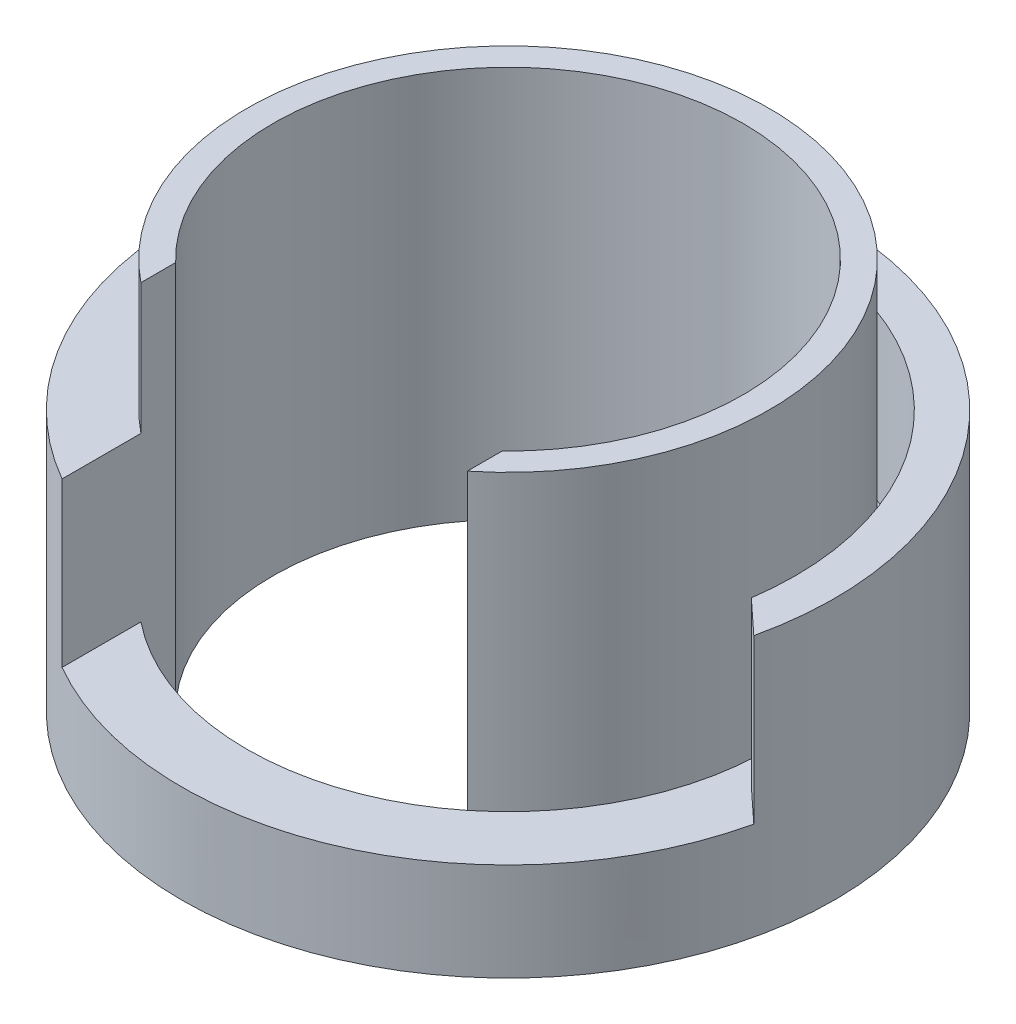
ISO-10303-21;
HEADER;
FILE_DESCRIPTION(('STEP AP214'),'2;1');
FILE_NAME('part.step','',(''),(''),'','','');
FILE_SCHEMA(('AUTOMOTIVE_DESIGN { 1 0 10303 214 1 1 1 1 }'));
ENDSEC;
DATA;
#1=APPLICATION_CONTEXT('core data for automotive mechanical design processes');
#2=APPLICATION_PROTOCOL_DEFINITION('international standard','automotive_design',2000,#1);
#3=PRODUCT_CONTEXT('',#1,'mechanical');
#4=PRODUCT('Part','Part','',(#3));
#5=PRODUCT_RELATED_PRODUCT_CATEGORY('part','',(#4));
#6=PRODUCT_DEFINITION_FORMATION('','',#4);
#7=PRODUCT_DEFINITION_CONTEXT('part definition',#1,'design');
#8=PRODUCT_DEFINITION('design','',#6,#7);
#9=PRODUCT_DEFINITION_SHAPE('','',#8);
#10=(LENGTH_UNIT() NAMED_UNIT(*) SI_UNIT(.MILLI.,.METRE.));
#11=(NAMED_UNIT(*) PLANE_ANGLE_UNIT() SI_UNIT($,.RADIAN.));
#12=(NAMED_UNIT(*) SI_UNIT($,.STERADIAN.) SOLID_ANGLE_UNIT());
#13=UNCERTAINTY_MEASURE_WITH_UNIT(LENGTH_MEASURE(1.E-05),#10,'distance_accuracy_value','');
#14=(GEOMETRIC_REPRESENTATION_CONTEXT(3) GLOBAL_UNCERTAINTY_ASSIGNED_CONTEXT((#13)) GLOBAL_UNIT_ASSIGNED_CONTEXT((#10,
#11,#12)) REPRESENTATION_CONTEXT('',''));
#15=CARTESIAN_POINT('',(0.,0.,0.));
#16=DIRECTION('',(0.,0.,1.));
#17=DIRECTION('',(1.,0.,0.));
#18=AXIS2_PLACEMENT_3D('',#15,#16,#17);
#19=CARTESIAN_POINT('',(0.,20.,0.));
#20=DIRECTION('',(0.,-1.,0.));
#21=DIRECTION('',(0.,0.,-1.));
#22=AXIS2_PLACEMENT_3D('',#19,#20,#21);
#23=CYLINDRICAL_SURFACE('',#22,20.);
#24=DIRECTION('',(0.,1.,0.));
#25=VECTOR('',#24,1.);
#26=CARTESIAN_POINT('',(-12.5,-53.5560435416942,15.612494995996));
#27=LINE('',#26,#25);
#28=CARTESIAN_POINT('',(-12.5,0.,15.612494995996));
#29=VERTEX_POINT('',#28);
#30=CARTESIAN_POINT('',(-12.5,7.5,15.612494995996));
#31=VERTEX_POINT('',#30);
#32=EDGE_CURVE('E56',#29,#31,#27,.T.);
#33=ORIENTED_EDGE('',*,*,#32,.T.);
#34=CARTESIAN_POINT('',(0.,7.5,0.));
#35=DIRECTION('',(0.,-1.,0.));
#36=DIRECTION('',(0.,0.,1.));
#37=AXIS2_PLACEMENT_3D('',#34,#35,#36);
#38=CIRCLE('',#37,20.);
#39=CARTESIAN_POINT('',(12.5,7.5,15.612494995996));
#40=VERTEX_POINT('',#39);
#41=EDGE_CURVE('E138',#40,#31,#38,.T.);
#42=ORIENTED_EDGE('',*,*,#41,.F.);
#43=DIRECTION('',(0.,1.,0.));
#44=VECTOR('',#43,1.);
#45=CARTESIAN_POINT('',(12.5,-53.5560435416942,15.612494995996));
#46=LINE('',#45,#44);
#47=CARTESIAN_POINT('',(12.5,0.,15.612494995996));
#48=VERTEX_POINT('',#47);
#49=EDGE_CURVE('E180',#48,#40,#46,.T.);
#50=ORIENTED_EDGE('',*,*,#49,.F.);
#51=CARTESIAN_POINT('',(0.,0.,0.));
#52=DIRECTION('',(0.,1.,0.));
#53=DIRECTION('',(0.,0.,1.));
#54=AXIS2_PLACEMENT_3D('',#51,#52,#53);
#55=CIRCLE('',#54,20.);
#56=EDGE_CURVE('E192',#29,#48,#55,.T.);
#57=ORIENTED_EDGE('',*,*,#56,.F.);
#58=EDGE_LOOP('',(#33,#42,#50,#57));
#59=FACE_BOUND('',#58,.T.);
#60=ADVANCED_FACE('F35',(#59),#23,.F.);
#61=CARTESIAN_POINT('',(0.,20.,0.));
#62=DIRECTION('',(0.,1.,0.));
#63=DIRECTION('',(0.,0.,1.));
#64=AXIS2_PLACEMENT_3D('',#61,#62,#63);
#65=PLANE('',#64);
#66=DIRECTION('',(0.12392464077455,0.,-0.99229163223767));
#67=VECTOR('',#66,1.);
#68=CARTESIAN_POINT('',(3.09811601936377,20.,-24.8072908059417));
#69=LINE('',#68,#67);
#70=CARTESIAN_POINT('',(2.72634209704013,20.,-21.8304159092287));
#71=VERTEX_POINT('',#70);
#72=CARTESIAN_POINT('',(3.09811601936377,20.,-24.8072908059417));
#73=VERTEX_POINT('',#72);
#74=EDGE_CURVE('E149',#71,#73,#69,.T.);
#75=ORIENTED_EDGE('',*,*,#74,.F.);
#76=CARTESIAN_POINT('',(0.,20.,0.));
#77=DIRECTION('',(0.,1.,0.));
#78=DIRECTION('',(0.,0.,1.));
#79=AXIS2_PLACEMENT_3D('',#76,#77,#78);
#80=CIRCLE('',#79,22.);
#81=CARTESIAN_POINT('',(21.7739745366638,20.,3.14547816344585));
#82=VERTEX_POINT('',#81);
#83=EDGE_CURVE('E363',#82,#71,#80,.T.);
#84=ORIENTED_EDGE('',*,*,#83,.F.);
#85=DIRECTION('',(-0.733212111192935,0.,-0.68));
#86=VECTOR('',#85,1.);
#87=CARTESIAN_POINT('',(21.7739745366638,20.,3.14547816344585));
#88=LINE('',#87,#86);
#89=CARTESIAN_POINT('',(24.3745078663875,20.,5.55728047442378));
#90=VERTEX_POINT('',#89);
#91=EDGE_CURVE('E370',#90,#82,#88,.T.);
#92=ORIENTED_EDGE('',*,*,#91,.F.);
#93=CARTESIAN_POINT('',(0.,20.,0.));
#94=DIRECTION('',(0.,1.,0.));
#95=DIRECTION('',(0.,0.,1.));
#96=AXIS2_PLACEMENT_3D('',#93,#94,#95);
#97=CIRCLE('',#96,25.);
#98=EDGE_CURVE('E11',#90,#73,#97,.T.);
#99=ORIENTED_EDGE('',*,*,#98,.T.);
#100=EDGE_LOOP('',(#75,#84,#92,#99));
#101=FACE_BOUND('',#100,.T.);
#102=ADVANCED_FACE('F215',(#101),#65,.T.);
#103=CARTESIAN_POINT('',(0.,20.,0.));
#104=DIRECTION('',(0.,-1.,0.));
#105=DIRECTION('',(0.,0.,-1.));
#106=AXIS2_PLACEMENT_3D('',#103,#104,#105);
#107=CYLINDRICAL_SURFACE('',#106,25.);
#108=CARTESIAN_POINT('',(0.,7.5,0.));
#109=DIRECTION('',(0.,1.,0.));
#110=DIRECTION('',(0.,0.,1.));
#111=AXIS2_PLACEMENT_3D('',#108,#109,#110);
#112=CIRCLE('',#111,25.);
#113=CARTESIAN_POINT('',(3.09811601936377,7.5,-24.8072908059417));
#114=VERTEX_POINT('',#113);
#115=CARTESIAN_POINT('',(-18.3303027798234,7.5,-17.));
#116=VERTEX_POINT('',#115);
#117=EDGE_CURVE('E139',#114,#116,#112,.T.);
#118=ORIENTED_EDGE('',*,*,#117,.F.);
#119=DIRECTION('',(0.,1.,0.));
#120=VECTOR('',#119,1.);
#121=CARTESIAN_POINT('',(3.09811601936377,7.5,-24.8072908059417));
#122=LINE('',#121,#120);
#123=EDGE_CURVE('E167',#114,#73,#122,.T.);
#124=ORIENTED_EDGE('',*,*,#123,.T.);
#125=ORIENTED_EDGE('',*,*,#98,.F.);
#126=DIRECTION('',(0.,1.,0.));
#127=VECTOR('',#126,1.);
#128=CARTESIAN_POINT('',(24.3745078663875,7.5,5.55728047442378));
#129=LINE('',#128,#127);
#130=CARTESIAN_POINT('',(24.3745078663875,7.5,5.55728047442378));
#131=VERTEX_POINT('',#130);
#132=EDGE_CURVE('E381',#131,#90,#129,.T.);
#133=ORIENTED_EDGE('',*,*,#132,.F.);
#134=CARTESIAN_POINT('',(0.,7.5,0.));
#135=DIRECTION('',(0.,1.,0.));
#136=DIRECTION('',(0.,0.,1.));
#137=AXIS2_PLACEMENT_3D('',#134,#135,#136);
#138=CIRCLE('',#137,25.);
#139=CARTESIAN_POINT('',(-12.5,7.5,21.650635094611));
#140=VERTEX_POINT('',#139);
#141=EDGE_CURVE('E384',#140,#131,#138,.T.);
#142=ORIENTED_EDGE('',*,*,#141,.F.);
#143=DIRECTION('',(0.,1.,0.));
#144=VECTOR('',#143,1.);
#145=CARTESIAN_POINT('',(-12.5,7.5,21.650635094611));
#146=LINE('',#145,#144);
#147=CARTESIAN_POINT('',(-12.5,20.,21.650635094611));
#148=VERTEX_POINT('',#147);
#149=EDGE_CURVE('E157',#140,#148,#146,.T.);
#150=ORIENTED_EDGE('',*,*,#149,.T.);
#151=CARTESIAN_POINT('',(-18.3303027798234,20.,-17.));
#152=VERTEX_POINT('',#151);
#153=EDGE_CURVE('E43',#152,#148,#97,.T.);
#154=ORIENTED_EDGE('',*,*,#153,.F.);
#155=DIRECTION('',(0.,1.,0.));
#156=VECTOR('',#155,1.);
#157=CARTESIAN_POINT('',(-18.3303027798234,7.5,-17.));
#158=LINE('',#157,#156);
#159=EDGE_CURVE('E132',#116,#152,#158,.T.);
#160=ORIENTED_EDGE('',*,*,#159,.F.);
#161=EDGE_LOOP('',(#118,#124,#125,#133,#142,#150,#154,#160));
#162=FACE_BOUND('',#161,.T.);
#163=CARTESIAN_POINT('',(0.,0.,0.));
#164=DIRECTION('',(0.,1.,0.));
#165=DIRECTION('',(0.,0.,1.));
#166=AXIS2_PLACEMENT_3D('',#163,#164,#165);
#167=CIRCLE('',#166,25.);
#168=CARTESIAN_POINT('',(0.,0.,25.));
#169=VERTEX_POINT('',#168);
#170=EDGE_CURVE('E38',#169,#169,#167,.T.);
#171=ORIENTED_EDGE('',*,*,#170,.T.);
#172=EDGE_LOOP('',(#171));
#173=FACE_BOUND('',#172,.T.);
#174=ADVANCED_FACE('F152',(#162,#173),#107,.T.);
#175=DIRECTION('',(0.,0.,1.));
#176=VECTOR('',#175,1.);
#177=CARTESIAN_POINT('',(-12.5,20.,21.650635094611));
#178=LINE('',#177,#176);
#179=CARTESIAN_POINT('',(-12.5,20.,15.612494995996));
#180=VERTEX_POINT('',#179);
#181=EDGE_CURVE('E371',#180,#148,#178,.T.);
#182=ORIENTED_EDGE('',*,*,#181,.F.);
#183=CARTESIAN_POINT('',(0.,20.,0.));
#184=DIRECTION('',(0.,1.,0.));
#185=DIRECTION('',(0.,0.,1.));
#186=AXIS2_PLACEMENT_3D('',#183,#184,#185);
#187=CIRCLE('',#186,20.);
#188=CARTESIAN_POINT('',(-14.6642422238587,20.,-13.6));
#189=VERTEX_POINT('',#188);
#190=EDGE_CURVE('E193',#189,#180,#187,.T.);
#191=ORIENTED_EDGE('',*,*,#190,.F.);
#192=DIRECTION('',(0.733212111192935,0.,0.68));
#193=VECTOR('',#192,1.);
#194=CARTESIAN_POINT('',(-18.3303027798234,20.,-17.));
#195=LINE('',#194,#193);
#196=EDGE_CURVE('E374',#152,#189,#195,.T.);
#197=ORIENTED_EDGE('',*,*,#196,.F.);
#198=ORIENTED_EDGE('',*,*,#153,.T.);
#199=EDGE_LOOP('',(#182,#191,#197,#198));
#200=FACE_BOUND('',#199,.T.);
#201=ADVANCED_FACE('F204',(#200),#65,.T.);
#202=CARTESIAN_POINT('',(0.,0.,0.));
#203=DIRECTION('',(0.,1.,0.));
#204=DIRECTION('',(0.,0.,1.));
#205=AXIS2_PLACEMENT_3D('',#202,#203,#204);
#206=PLANE('',#205);
#207=ORIENTED_EDGE('',*,*,#56,.T.);
#208=DIRECTION('',(0.,0.,-1.));
#209=VECTOR('',#208,1.);
#210=CARTESIAN_POINT('',(12.5,0.,15.612494995996));
#211=LINE('',#210,#209);
#212=CARTESIAN_POINT('',(12.5,0.,12.9518338469886));
#213=VERTEX_POINT('',#212);
#214=EDGE_CURVE('E179',#48,#213,#211,.T.);
#215=ORIENTED_EDGE('',*,*,#214,.T.);
#216=CARTESIAN_POINT('',(0.,0.,0.));
#217=DIRECTION('',(0.,1.,0.));
#218=DIRECTION('',(0.,0.,1.));
#219=AXIS2_PLACEMENT_3D('',#216,#217,#218);
#220=CIRCLE('',#219,18.);
#221=CARTESIAN_POINT('',(-12.5,0.,12.9518338469886));
#222=VERTEX_POINT('',#221);
#223=EDGE_CURVE('E177',#213,#222,#220,.T.);
#224=ORIENTED_EDGE('',*,*,#223,.T.);
#225=DIRECTION('',(0.,0.,1.));
#226=VECTOR('',#225,1.);
#227=CARTESIAN_POINT('',(-12.5,0.,15.612494995996));
#228=LINE('',#227,#226);
#229=EDGE_CURVE('E182',#222,#29,#228,.T.);
#230=ORIENTED_EDGE('',*,*,#229,.T.);
#231=EDGE_LOOP('',(#207,#215,#224,#230));
#232=FACE_BOUND('',#231,.T.);
#233=ORIENTED_EDGE('',*,*,#170,.F.);
#234=EDGE_LOOP('',(#233));
#235=FACE_BOUND('',#234,.T.);
#236=ADVANCED_FACE('F201',(#232,#235),#206,.F.);
#237=CARTESIAN_POINT('',(0.,-53.5560435416942,0.));
#238=DIRECTION('',(0.,1.,0.));
#239=DIRECTION('',(0.,0.,1.));
#240=AXIS2_PLACEMENT_3D('',#237,#238,#239);
#241=CYLINDRICAL_SURFACE('',#240,20.);
#242=CARTESIAN_POINT('',(12.5,30.,15.612494995996));
#243=VERTEX_POINT('',#242);
#244=EDGE_CURVE('E185',#40,#243,#46,.T.);
#245=ORIENTED_EDGE('',*,*,#244,.F.);
#246=CARTESIAN_POINT('',(-14.6642422238587,7.5,-13.6));
#247=VERTEX_POINT('',#246);
#248=EDGE_CURVE('E393',#247,#40,#38,.T.);
#249=ORIENTED_EDGE('',*,*,#248,.F.);
#250=DIRECTION('',(0.,1.,0.));
#251=VECTOR('',#250,1.);
#252=CARTESIAN_POINT('',(-14.6642422238587,7.5,-13.6));
#253=LINE('',#252,#251);
#254=EDGE_CURVE('E134',#247,#189,#253,.T.);
#255=ORIENTED_EDGE('',*,*,#254,.T.);
#256=ORIENTED_EDGE('',*,*,#190,.T.);
#257=CARTESIAN_POINT('',(-12.5,30.,15.612494995996));
#258=VERTEX_POINT('',#257);
#259=EDGE_CURVE('E176',#180,#258,#27,.T.);
#260=ORIENTED_EDGE('',*,*,#259,.T.);
#261=CARTESIAN_POINT('',(0.,30.,0.));
#262=DIRECTION('',(0.,1.,0.));
#263=DIRECTION('',(0.,0.,1.));
#264=AXIS2_PLACEMENT_3D('',#261,#262,#263);
#265=CIRCLE('',#264,20.);
#266=EDGE_CURVE('E163',#243,#258,#265,.T.);
#267=ORIENTED_EDGE('',*,*,#266,.F.);
#268=EDGE_LOOP('',(#245,#249,#255,#256,#260,#267));
#269=FACE_BOUND('',#268,.T.);
#270=ADVANCED_FACE('F203',(#269),#241,.T.);
#271=CARTESIAN_POINT('',(12.5,-53.5560435416942,15.612494995996));
#272=DIRECTION('',(-1.,0.,0.));
#273=DIRECTION('',(0.,0.,1.));
#274=AXIS2_PLACEMENT_3D('',#271,#272,#273);
#275=PLANE('',#274);
#276=ORIENTED_EDGE('',*,*,#214,.F.);
#277=ORIENTED_EDGE('',*,*,#49,.T.);
#278=ORIENTED_EDGE('',*,*,#244,.T.);
#279=DIRECTION('',(0.,0.,1.));
#280=VECTOR('',#279,1.);
#281=CARTESIAN_POINT('',(12.5,30.,15.612494995996));
#282=LINE('',#281,#280);
#283=CARTESIAN_POINT('',(12.5,30.,12.9518338469886));
#284=VERTEX_POINT('',#283);
#285=EDGE_CURVE('E173',#284,#243,#282,.T.);
#286=ORIENTED_EDGE('',*,*,#285,.F.);
#287=DIRECTION('',(0.,1.,0.));
#288=VECTOR('',#287,1.);
#289=CARTESIAN_POINT('',(12.5,-53.5560435416942,12.9518338469886));
#290=LINE('',#289,#288);
#291=EDGE_CURVE('E186',#213,#284,#290,.T.);
#292=ORIENTED_EDGE('',*,*,#291,.F.);
#293=EDGE_LOOP('',(#276,#277,#278,#286,#292));
#294=FACE_BOUND('',#293,.T.);
#295=ADVANCED_FACE('F210',(#294),#275,.T.);
#296=CARTESIAN_POINT('',(0.,-53.5560435416942,0.));
#297=DIRECTION('',(0.,1.,0.));
#298=DIRECTION('',(0.,0.,1.));
#299=AXIS2_PLACEMENT_3D('',#296,#297,#298);
#300=CYLINDRICAL_SURFACE('',#299,18.);
#301=ORIENTED_EDGE('',*,*,#223,.F.);
#302=ORIENTED_EDGE('',*,*,#291,.T.);
#303=CARTESIAN_POINT('',(0.,30.,0.));
#304=DIRECTION('',(0.,-1.,0.));
#305=DIRECTION('',(0.,0.,1.));
#306=AXIS2_PLACEMENT_3D('',#303,#304,#305);
#307=CIRCLE('',#306,18.);
#308=CARTESIAN_POINT('',(-12.5,30.,12.9518338469886));
#309=VERTEX_POINT('',#308);
#310=EDGE_CURVE('E170',#309,#284,#307,.T.);
#311=ORIENTED_EDGE('',*,*,#310,.F.);
#312=DIRECTION('',(0.,1.,0.));
#313=VECTOR('',#312,1.);
#314=CARTESIAN_POINT('',(-12.5,-53.5560435416942,12.9518338469886));
#315=LINE('',#314,#313);
#316=EDGE_CURVE('E188',#222,#309,#315,.T.);
#317=ORIENTED_EDGE('',*,*,#316,.F.);
#318=EDGE_LOOP('',(#301,#302,#311,#317));
#319=FACE_BOUND('',#318,.T.);
#320=ADVANCED_FACE('F230',(#319),#300,.F.);
#321=CARTESIAN_POINT('',(-12.5,-53.5560435416942,15.612494995996));
#322=DIRECTION('',(1.,0.,0.));
#323=DIRECTION('',(0.,0.,-1.));
#324=AXIS2_PLACEMENT_3D('',#321,#322,#323);
#325=PLANE('',#324);
#326=ORIENTED_EDGE('',*,*,#229,.F.);
#327=ORIENTED_EDGE('',*,*,#316,.T.);
#328=DIRECTION('',(0.,0.,-1.));
#329=VECTOR('',#328,1.);
#330=CARTESIAN_POINT('',(-12.5,30.,15.612494995996));
#331=LINE('',#330,#329);
#332=EDGE_CURVE('E166',#258,#309,#331,.T.);
#333=ORIENTED_EDGE('',*,*,#332,.F.);
#334=ORIENTED_EDGE('',*,*,#259,.F.);
#335=ORIENTED_EDGE('',*,*,#181,.T.);
#336=ORIENTED_EDGE('',*,*,#149,.F.);
#337=DIRECTION('',(0.,0.,1.));
#338=VECTOR('',#337,1.);
#339=CARTESIAN_POINT('',(-12.5,7.5,21.650635094611));
#340=LINE('',#339,#338);
#341=EDGE_CURVE('E51',#31,#140,#340,.T.);
#342=ORIENTED_EDGE('',*,*,#341,.F.);
#343=ORIENTED_EDGE('',*,*,#32,.F.);
#344=EDGE_LOOP('',(#326,#327,#333,#334,#335,#336,#342,#343));
#345=FACE_BOUND('',#344,.T.);
#346=ADVANCED_FACE('F233',(#345),#325,.T.);
#347=CARTESIAN_POINT('',(0.,30.,0.));
#348=DIRECTION('',(0.,1.,0.));
#349=DIRECTION('',(0.,0.,1.));
#350=AXIS2_PLACEMENT_3D('',#347,#348,#349);
#351=PLANE('',#350);
#352=ORIENTED_EDGE('',*,*,#266,.T.);
#353=ORIENTED_EDGE('',*,*,#332,.T.);
#354=ORIENTED_EDGE('',*,*,#310,.T.);
#355=ORIENTED_EDGE('',*,*,#285,.T.);
#356=EDGE_LOOP('',(#352,#353,#354,#355));
#357=FACE_BOUND('',#356,.T.);
#358=ADVANCED_FACE('F235',(#357),#351,.T.);
#359=CARTESIAN_POINT('',(3.09811601936377,7.5,-24.8072908059417));
#360=DIRECTION('',(0.99229163223767,0.,0.12392464077455));
#361=DIRECTION('',(0.12392464077455,0.,-0.99229163223767));
#362=AXIS2_PLACEMENT_3D('',#359,#360,#361);
#363=PLANE('',#362);
#364=ORIENTED_EDGE('',*,*,#74,.T.);
#365=ORIENTED_EDGE('',*,*,#123,.F.);
#366=DIRECTION('',(0.12392464077455,0.,-0.99229163223767));
#367=VECTOR('',#366,1.);
#368=CARTESIAN_POINT('',(3.09811601936377,7.5,-24.8072908059417));
#369=LINE('',#368,#367);
#370=CARTESIAN_POINT('',(2.72634209704013,7.5,-21.8304159092287));
#371=VERTEX_POINT('',#370);
#372=EDGE_CURVE('E146',#371,#114,#369,.T.);
#373=ORIENTED_EDGE('',*,*,#372,.F.);
#374=DIRECTION('',(0.,1.,0.));
#375=VECTOR('',#374,1.);
#376=CARTESIAN_POINT('',(2.72634209704013,7.5,-21.8304159092287));
#377=LINE('',#376,#375);
#378=EDGE_CURVE('E360',#371,#71,#377,.T.);
#379=ORIENTED_EDGE('',*,*,#378,.T.);
#380=EDGE_LOOP('',(#364,#365,#373,#379));
#381=FACE_BOUND('',#380,.T.);
#382=ADVANCED_FACE('F241',(#381),#363,.F.);
#383=CARTESIAN_POINT('',(0.,7.5,0.));
#384=DIRECTION('',(0.,1.,0.));
#385=DIRECTION('',(0.,0.,1.));
#386=AXIS2_PLACEMENT_3D('',#383,#384,#385);
#387=CYLINDRICAL_SURFACE('',#386,22.);
#388=ORIENTED_EDGE('',*,*,#83,.T.);
#389=ORIENTED_EDGE('',*,*,#378,.F.);
#390=CARTESIAN_POINT('',(0.,7.5,0.));
#391=DIRECTION('',(0.,1.,0.));
#392=DIRECTION('',(0.,0.,1.));
#393=AXIS2_PLACEMENT_3D('',#390,#391,#392);
#394=CIRCLE('',#393,22.);
#395=CARTESIAN_POINT('',(21.7739745366638,7.5,3.14547816344585));
#396=VERTEX_POINT('',#395);
#397=EDGE_CURVE('E159',#396,#371,#394,.T.);
#398=ORIENTED_EDGE('',*,*,#397,.F.);
#399=DIRECTION('',(0.,1.,0.));
#400=VECTOR('',#399,1.);
#401=CARTESIAN_POINT('',(21.7739745366638,7.5,3.14547816344585));
#402=LINE('',#401,#400);
#403=EDGE_CURVE('E379',#396,#82,#402,.T.);
#404=ORIENTED_EDGE('',*,*,#403,.T.);
#405=EDGE_LOOP('',(#388,#389,#398,#404));
#406=FACE_BOUND('',#405,.T.);
#407=ADVANCED_FACE('F253',(#406),#387,.F.);
#408=CARTESIAN_POINT('',(21.7739745366638,7.5,3.14547816344585));
#409=DIRECTION('',(0.68,0.,-0.733212111192935));
#410=DIRECTION('',(-0.733212111192935,0.,-0.68));
#411=AXIS2_PLACEMENT_3D('',#408,#409,#410);
#412=PLANE('',#411);
#413=ORIENTED_EDGE('',*,*,#91,.T.);
#414=ORIENTED_EDGE('',*,*,#403,.F.);
#415=DIRECTION('',(-0.733212111192935,0.,-0.68));
#416=VECTOR('',#415,1.);
#417=CARTESIAN_POINT('',(21.7739745366638,7.5,3.14547816344585));
#418=LINE('',#417,#416);
#419=EDGE_CURVE('E388',#131,#396,#418,.T.);
#420=ORIENTED_EDGE('',*,*,#419,.F.);
#421=ORIENTED_EDGE('',*,*,#132,.T.);
#422=EDGE_LOOP('',(#413,#414,#420,#421));
#423=FACE_BOUND('',#422,.T.);
#424=ADVANCED_FACE('F250',(#423),#412,.F.);
#425=CARTESIAN_POINT('',(-18.3303027798234,7.5,-17.));
#426=DIRECTION('',(-0.68,0.,0.733212111192935));
#427=DIRECTION('',(0.733212111192935,0.,0.68));
#428=AXIS2_PLACEMENT_3D('',#425,#426,#427);
#429=PLANE('',#428);
#430=ORIENTED_EDGE('',*,*,#196,.T.);
#431=ORIENTED_EDGE('',*,*,#254,.F.);
#432=DIRECTION('',(0.733212111192935,0.,0.68));
#433=VECTOR('',#432,1.);
#434=CARTESIAN_POINT('',(-18.3303027798234,7.5,-17.));
#435=LINE('',#434,#433);
#436=EDGE_CURVE('E127',#116,#247,#435,.T.);
#437=ORIENTED_EDGE('',*,*,#436,.F.);
#438=ORIENTED_EDGE('',*,*,#159,.T.);
#439=EDGE_LOOP('',(#430,#431,#437,#438));
#440=FACE_BOUND('',#439,.T.);
#441=ADVANCED_FACE('F130',(#440),#429,.F.);
#442=CARTESIAN_POINT('',(0.,7.5,0.));
#443=DIRECTION('',(0.,1.,0.));
#444=DIRECTION('',(0.,0.,1.));
#445=AXIS2_PLACEMENT_3D('',#442,#443,#444);
#446=PLANE('',#445);
#447=ORIENTED_EDGE('',*,*,#117,.T.);
#448=ORIENTED_EDGE('',*,*,#436,.T.);
#449=ORIENTED_EDGE('',*,*,#248,.T.);
#450=ORIENTED_EDGE('',*,*,#41,.T.);
#451=ORIENTED_EDGE('',*,*,#341,.T.);
#452=ORIENTED_EDGE('',*,*,#141,.T.);
#453=ORIENTED_EDGE('',*,*,#419,.T.);
#454=ORIENTED_EDGE('',*,*,#397,.T.);
#455=ORIENTED_EDGE('',*,*,#372,.T.);
#456=EDGE_LOOP('',(#447,#448,#449,#450,#451,#452,#453,#454,#455));
#457=FACE_BOUND('',#456,.T.);
#458=ADVANCED_FACE('F143',(#457),#446,.T.);
#459=CLOSED_SHELL('',(#60,#102,#174,#201,#236,#270,#295,#320,#346,#358,#382,#407,#424,#441,#458));
#460=MANIFOLD_SOLID_BREP('B2',#459);
#461=ADVANCED_BREP_SHAPE_REPRESENTATION('',(#18,#460),#14);
#462=SHAPE_DEFINITION_REPRESENTATION(#9,#461);
ENDSEC;
END-ISO-10303-21;
